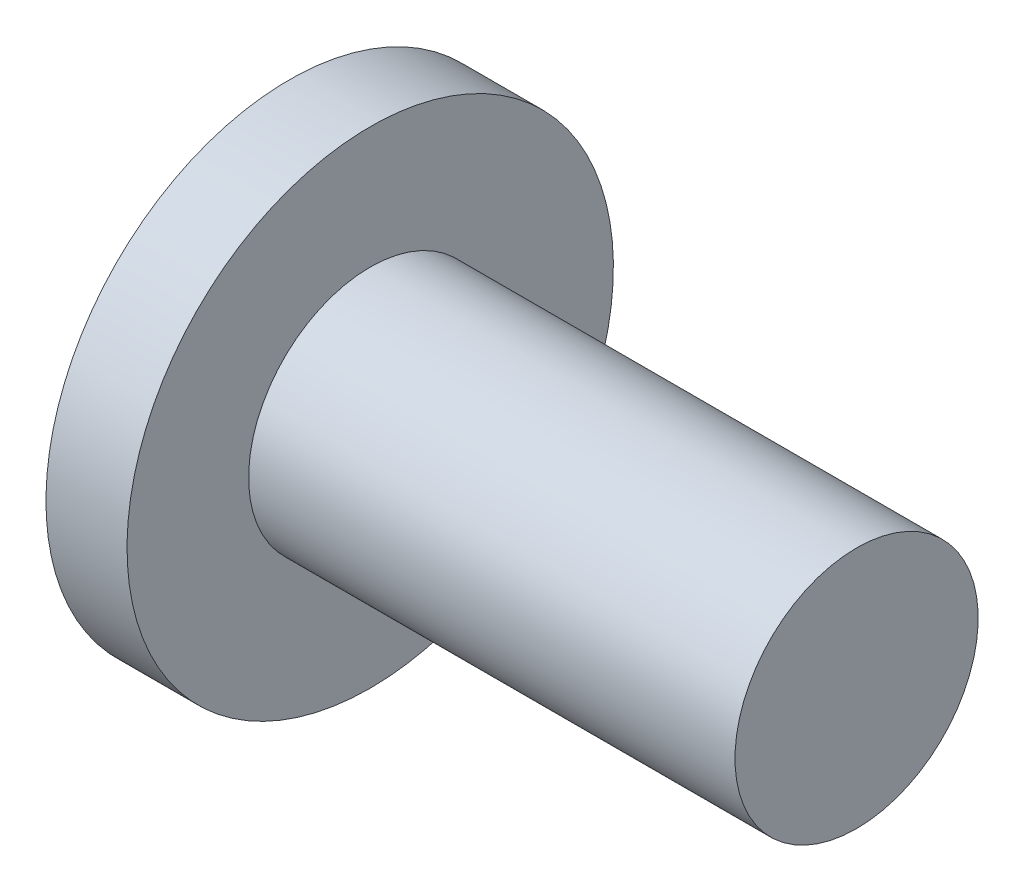
ISO-10303-21;
HEADER;
FILE_DESCRIPTION(('STEP AP214'),'2;1');
FILE_NAME('part.step','',(''),(''),'','','');
FILE_SCHEMA(('AUTOMOTIVE_DESIGN { 1 0 10303 214 1 1 1 1 }'));
ENDSEC;
DATA;
#1=APPLICATION_CONTEXT('core data for automotive mechanical design processes');
#2=APPLICATION_PROTOCOL_DEFINITION('international standard','automotive_design',2000,#1);
#3=PRODUCT_CONTEXT('',#1,'mechanical');
#4=PRODUCT('Part','Part','',(#3));
#5=PRODUCT_RELATED_PRODUCT_CATEGORY('part','',(#4));
#6=PRODUCT_DEFINITION_FORMATION('','',#4);
#7=PRODUCT_DEFINITION_CONTEXT('part definition',#1,'design');
#8=PRODUCT_DEFINITION('design','',#6,#7);
#9=PRODUCT_DEFINITION_SHAPE('','',#8);
#10=(LENGTH_UNIT() NAMED_UNIT(*) SI_UNIT(.MILLI.,.METRE.));
#11=(NAMED_UNIT(*) PLANE_ANGLE_UNIT() SI_UNIT($,.RADIAN.));
#12=(NAMED_UNIT(*) SI_UNIT($,.STERADIAN.) SOLID_ANGLE_UNIT());
#13=UNCERTAINTY_MEASURE_WITH_UNIT(LENGTH_MEASURE(1.E-05),#10,'distance_accuracy_value','');
#14=(GEOMETRIC_REPRESENTATION_CONTEXT(3) GLOBAL_UNCERTAINTY_ASSIGNED_CONTEXT((#13)) GLOBAL_UNIT_ASSIGNED_CONTEXT((#10,
#11,#12)) REPRESENTATION_CONTEXT('',''));
#15=CARTESIAN_POINT('',(0.,0.,0.));
#16=DIRECTION('',(0.,0.,1.));
#17=DIRECTION('',(1.,0.,0.));
#18=AXIS2_PLACEMENT_3D('',#15,#16,#17);
#19=CARTESIAN_POINT('',(0.,0.,0.));
#20=DIRECTION('',(-1.,0.,0.));
#21=DIRECTION('',(0.,-1.,0.));
#22=AXIS2_PLACEMENT_3D('',#19,#20,#21);
#23=PLANE('',#22);
#24=CARTESIAN_POINT('',(0.,-1.5,0.));
#25=DIRECTION('',(-1.,0.,0.));
#26=DIRECTION('',(0.,-1.,0.));
#27=AXIS2_PLACEMENT_3D('',#24,#25,#26);
#28=CIRCLE('',#27,3.);
#29=CARTESIAN_POINT('',(0.,-4.5,0.));
#30=VERTEX_POINT('',#29);
#31=EDGE_CURVE('E10',#30,#30,#28,.T.);
#32=ORIENTED_EDGE('',*,*,#31,.F.);
#33=EDGE_LOOP('',(#32));
#34=FACE_BOUND('',#33,.T.);
#35=CARTESIAN_POINT('',(0.,-1.5,0.));
#36=DIRECTION('',(-1.,0.,0.));
#37=DIRECTION('',(0.,-1.,0.));
#38=AXIS2_PLACEMENT_3D('',#35,#36,#37);
#39=CIRCLE('',#38,1.5);
#40=CARTESIAN_POINT('',(0.,-3.,0.));
#41=VERTEX_POINT('',#40);
#42=EDGE_CURVE('E46',#41,#41,#39,.T.);
#43=ORIENTED_EDGE('',*,*,#42,.T.);
#44=EDGE_LOOP('',(#43));
#45=FACE_BOUND('',#44,.T.);
#46=ADVANCED_FACE('F32',(#34,#45),#23,.F.);
#47=CARTESIAN_POINT('',(-1.,-1.5,0.));
#48=DIRECTION('',(-1.,0.,0.));
#49=DIRECTION('',(0.,-1.,0.));
#50=AXIS2_PLACEMENT_3D('',#47,#48,#49);
#51=CYLINDRICAL_SURFACE('',#50,3.);
#52=CARTESIAN_POINT('',(-1.,-1.5,0.));
#53=DIRECTION('',(-1.,0.,0.));
#54=DIRECTION('',(0.,-1.,0.));
#55=AXIS2_PLACEMENT_3D('',#52,#53,#54);
#56=CIRCLE('',#55,3.);
#57=CARTESIAN_POINT('',(-0.999999999999999,-4.5,0.));
#58=VERTEX_POINT('',#57);
#59=EDGE_CURVE('E38',#58,#58,#56,.T.);
#60=ORIENTED_EDGE('',*,*,#59,.F.);
#61=EDGE_LOOP('',(#60));
#62=FACE_BOUND('',#61,.T.);
#63=ORIENTED_EDGE('',*,*,#31,.T.);
#64=EDGE_LOOP('',(#63));
#65=FACE_BOUND('',#64,.T.);
#66=ADVANCED_FACE('F66',(#62,#65),#51,.T.);
#67=CARTESIAN_POINT('',(-1.,1.5,0.));
#68=DIRECTION('',(1.,0.,0.));
#69=DIRECTION('',(0.,1.,0.));
#70=AXIS2_PLACEMENT_3D('',#67,#68,#69);
#71=PLANE('',#70);
#72=ORIENTED_EDGE('',*,*,#59,.T.);
#73=EDGE_LOOP('',(#72));
#74=FACE_BOUND('',#73,.T.);
#75=ADVANCED_FACE('F61',(#74),#71,.F.);
#76=CARTESIAN_POINT('',(6.,0.,0.));
#77=DIRECTION('',(-1.,0.,0.));
#78=DIRECTION('',(0.,-1.,0.));
#79=AXIS2_PLACEMENT_3D('',#76,#77,#78);
#80=PLANE('',#79);
#81=CARTESIAN_POINT('',(6.,-1.5,0.));
#82=DIRECTION('',(-1.,0.,0.));
#83=DIRECTION('',(0.,-1.,0.));
#84=AXIS2_PLACEMENT_3D('',#81,#82,#83);
#85=CIRCLE('',#84,1.5);
#86=CARTESIAN_POINT('',(6.,-3.,0.));
#87=VERTEX_POINT('',#86);
#88=EDGE_CURVE('E42',#87,#87,#85,.T.);
#89=ORIENTED_EDGE('',*,*,#88,.F.);
#90=EDGE_LOOP('',(#89));
#91=FACE_BOUND('',#90,.T.);
#92=ADVANCED_FACE('F56',(#91),#80,.F.);
#93=CARTESIAN_POINT('',(-1.,-1.5,0.));
#94=DIRECTION('',(-1.,0.,0.));
#95=DIRECTION('',(0.,-1.,0.));
#96=AXIS2_PLACEMENT_3D('',#93,#94,#95);
#97=CYLINDRICAL_SURFACE('',#96,1.5);
#98=ORIENTED_EDGE('',*,*,#42,.F.);
#99=EDGE_LOOP('',(#98));
#100=FACE_BOUND('',#99,.T.);
#101=ORIENTED_EDGE('',*,*,#88,.T.);
#102=EDGE_LOOP('',(#101));
#103=FACE_BOUND('',#102,.T.);
#104=ADVANCED_FACE('F53',(#100,#103),#97,.T.);
#105=CLOSED_SHELL('',(#46,#66,#75,#92,#104));
#106=MANIFOLD_SOLID_BREP('B2',#105);
#107=ADVANCED_BREP_SHAPE_REPRESENTATION('',(#18,#106),#14);
#108=SHAPE_DEFINITION_REPRESENTATION(#9,#107);
ENDSEC;
END-ISO-10303-21;
